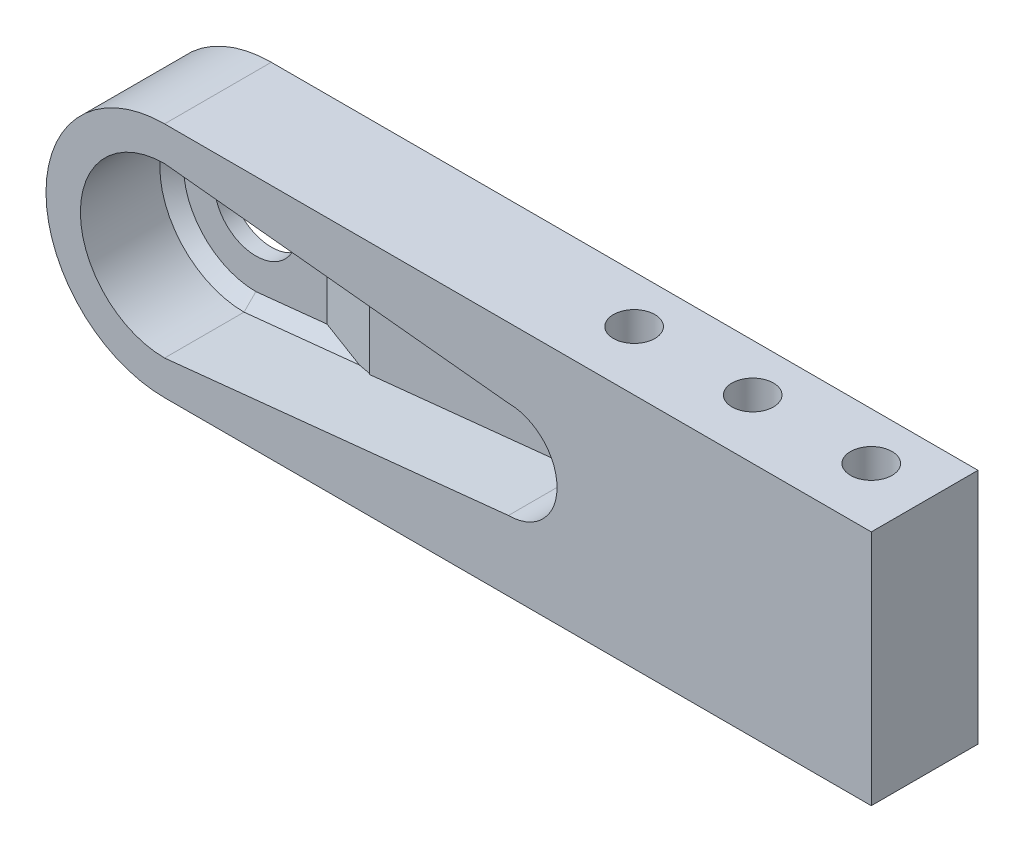
ISO-10303-21;
HEADER;
FILE_DESCRIPTION(('STEP AP214'),'2;1');
FILE_NAME('part.step','',(''),(''),'','','');
FILE_SCHEMA(('AUTOMOTIVE_DESIGN { 1 0 10303 214 1 1 1 1 }'));
ENDSEC;
DATA;
#1=APPLICATION_CONTEXT('core data for automotive mechanical design processes');
#2=APPLICATION_PROTOCOL_DEFINITION('international standard','automotive_design',2000,#1);
#3=PRODUCT_CONTEXT('',#1,'mechanical');
#4=PRODUCT('Part','Part','',(#3));
#5=PRODUCT_RELATED_PRODUCT_CATEGORY('part','',(#4));
#6=PRODUCT_DEFINITION_FORMATION('','',#4);
#7=PRODUCT_DEFINITION_CONTEXT('part definition',#1,'design');
#8=PRODUCT_DEFINITION('design','',#6,#7);
#9=PRODUCT_DEFINITION_SHAPE('','',#8);
#10=(LENGTH_UNIT() NAMED_UNIT(*) SI_UNIT(.MILLI.,.METRE.));
#11=(NAMED_UNIT(*) PLANE_ANGLE_UNIT() SI_UNIT($,.RADIAN.));
#12=(NAMED_UNIT(*) SI_UNIT($,.STERADIAN.) SOLID_ANGLE_UNIT());
#13=UNCERTAINTY_MEASURE_WITH_UNIT(LENGTH_MEASURE(1.E-05),#10,'distance_accuracy_value','');
#14=(GEOMETRIC_REPRESENTATION_CONTEXT(3) GLOBAL_UNCERTAINTY_ASSIGNED_CONTEXT((#13)) GLOBAL_UNIT_ASSIGNED_CONTEXT((#10,
#11,#12)) REPRESENTATION_CONTEXT('',''));
#15=CARTESIAN_POINT('',(0.,0.,0.));
#16=DIRECTION('',(0.,0.,1.));
#17=DIRECTION('',(1.,0.,0.));
#18=AXIS2_PLACEMENT_3D('',#15,#16,#17);
#19=CARTESIAN_POINT('',(0.,2.9,2.3));
#20=DIRECTION('',(-0.0727606875108999,0.703353312605366,0.707106781186547));
#21=DIRECTION('',(0.994691793826551,0.102899151085505,0.));
#22=AXIS2_PLACEMENT_3D('',#19,#20,#21);
#23=PLANE('',#22);
#24=CARTESIAN_POINT('',(-0.000546209909033546,3.90528002912067,1.3));
#25=DIRECTION('',(0.994691793826551,0.102899151085505,0.));
#26=VECTOR('',#25,1.);
#27=LINE('',#24,#26);
#28=CARTESIAN_POINT('',(0.,3.9,1.3));
#29=VERTEX_POINT('',#28);
#30=CARTESIAN_POINT('',(5.99999999999994,4.52602618876643,1.3));
#31=VERTEX_POINT('',#30);
#32=EDGE_CURVE('E234',#29,#31,#27,.T.);
#33=ORIENTED_EDGE('',*,*,#32,.F.);
#34=CARTESIAN_POINT('',(-0.000273104954515824,3.90264001456034,1.30265410308672));
#35=DIRECTION('',(0.000193115045492811,-0.708976050495938,0.705232530822112));
#36=VECTOR('',#35,1.);
#37=LINE('',#34,#36);
#38=CARTESIAN_POINT('',(0.,2.9,2.3));
#39=VERTEX_POINT('',#38);
#40=EDGE_CURVE('E241',#29,#39,#37,.T.);
#41=ORIENTED_EDGE('',*,*,#40,.T.);
#42=DIRECTION('',(0.994691793826551,0.102899151085505,0.));
#43=VECTOR('',#42,1.);
#44=CARTESIAN_POINT('',(0.,2.9,2.3));
#45=LINE('',#44,#43);
#46=CARTESIAN_POINT('',(9.73205080756886,3.90676387664506,2.3));
#47=VERTEX_POINT('',#46);
#48=EDGE_CURVE('E146',#39,#47,#45,.T.);
#49=ORIENTED_EDGE('',*,*,#48,.T.);
#50=DIRECTION('',(0.953753176121489,-0.158257062267282,0.255557393320368));
#51=VECTOR('',#50,1.);
#52=CARTESIAN_POINT('',(10.9484457034078,3.70492645414208,2.62593203001738));
#53=LINE('',#52,#51);
#54=EDGE_CURVE('E226',#47,#31,#53,.F.);
#55=ORIENTED_EDGE('',*,*,#54,.T.);
#56=EDGE_LOOP('',(#33,#41,#49,#55));
#57=FACE_BOUND('',#56,.T.);
#58=ADVANCED_FACE('F35',(#57),#23,.T.);
#59=CARTESIAN_POINT('',(0.,10.,6.));
#60=DIRECTION('',(0.,0.,-1.));
#61=DIRECTION('',(-1.,0.,0.));
#62=AXIS2_PLACEMENT_3D('',#59,#60,#61);
#63=CYLINDRICAL_SURFACE('',#62,10.);
#64=CARTESIAN_POINT('',(0.,10.,0.));
#65=DIRECTION('',(0.,0.,1.));
#66=DIRECTION('',(1.,0.,0.));
#67=AXIS2_PLACEMENT_3D('',#64,#65,#66);
#68=CIRCLE('',#67,10.);
#69=CARTESIAN_POINT('',(0.,20.,0.));
#70=VERTEX_POINT('',#69);
#71=CARTESIAN_POINT('',(0.,0.,0.));
#72=VERTEX_POINT('',#71);
#73=EDGE_CURVE('E233',#70,#72,#68,.T.);
#74=ORIENTED_EDGE('',*,*,#73,.T.);
#75=DIRECTION('',(0.,0.,-1.));
#76=VECTOR('',#75,1.);
#77=CARTESIAN_POINT('',(0.,0.,6.));
#78=LINE('',#77,#76);
#79=CARTESIAN_POINT('',(0.,0.,9.));
#80=VERTEX_POINT('',#79);
#81=EDGE_CURVE('E11',#80,#72,#78,.T.);
#82=ORIENTED_EDGE('',*,*,#81,.F.);
#83=CARTESIAN_POINT('',(0.,10.,9.));
#84=DIRECTION('',(0.,0.,1.));
#85=DIRECTION('',(1.,0.,0.));
#86=AXIS2_PLACEMENT_3D('',#83,#84,#85);
#87=CIRCLE('',#86,10.);
#88=CARTESIAN_POINT('',(0.,20.,9.));
#89=VERTEX_POINT('',#88);
#90=EDGE_CURVE('E181',#89,#80,#87,.T.);
#91=ORIENTED_EDGE('',*,*,#90,.F.);
#92=DIRECTION('',(0.,0.,-1.));
#93=VECTOR('',#92,1.);
#94=CARTESIAN_POINT('',(0.,20.,6.));
#95=LINE('',#94,#93);
#96=EDGE_CURVE('E351',#89,#70,#95,.T.);
#97=ORIENTED_EDGE('',*,*,#96,.T.);
#98=EDGE_LOOP('',(#74,#82,#91,#97));
#99=FACE_BOUND('',#98,.T.);
#100=ADVANCED_FACE('F37',(#99),#63,.T.);
#101=CARTESIAN_POINT('',(0.,0.,6.));
#102=DIRECTION('',(0.,1.,0.));
#103=DIRECTION('',(-1.,0.,0.));
#104=AXIS2_PLACEMENT_3D('',#101,#102,#103);
#105=PLANE('',#104);
#106=CARTESIAN_POINT('',(44.6,0.,3.99999999999993));
#107=DIRECTION('',(0.,-1.,0.));
#108=DIRECTION('',(1.,0.,0.));
#109=AXIS2_PLACEMENT_3D('',#106,#107,#108);
#110=CIRCLE('',#109,1.75);
#111=CARTESIAN_POINT('',(46.35,0.,3.99999999999993));
#112=VERTEX_POINT('',#111);
#113=EDGE_CURVE('E602',#112,#112,#110,.T.);
#114=ORIENTED_EDGE('',*,*,#113,.F.);
#115=EDGE_LOOP('',(#114));
#116=FACE_BOUND('',#115,.T.);
#117=CARTESIAN_POINT('',(34.6,0.,3.99999999999986));
#118=DIRECTION('',(0.,-1.,0.));
#119=DIRECTION('',(1.,0.,0.));
#120=AXIS2_PLACEMENT_3D('',#117,#118,#119);
#121=CIRCLE('',#120,1.75);
#122=CARTESIAN_POINT('',(36.35,0.,3.99999999999986));
#123=VERTEX_POINT('',#122);
#124=EDGE_CURVE('E607',#123,#123,#121,.T.);
#125=ORIENTED_EDGE('',*,*,#124,.F.);
#126=EDGE_LOOP('',(#125));
#127=FACE_BOUND('',#126,.T.);
#128=CARTESIAN_POINT('',(54.6,0.,4.));
#129=DIRECTION('',(0.,-1.,0.));
#130=DIRECTION('',(1.,0.,0.));
#131=AXIS2_PLACEMENT_3D('',#128,#129,#130);
#132=CIRCLE('',#131,1.75);
#133=CARTESIAN_POINT('',(56.35,0.,4.));
#134=VERTEX_POINT('',#133);
#135=EDGE_CURVE('E613',#134,#134,#132,.T.);
#136=ORIENTED_EDGE('',*,*,#135,.F.);
#137=EDGE_LOOP('',(#136));
#138=FACE_BOUND('',#137,.T.);
#139=DIRECTION('',(1.,0.,0.));
#140=VECTOR('',#139,1.);
#141=CARTESIAN_POINT('',(0.,0.,0.));
#142=LINE('',#141,#140);
#143=CARTESIAN_POINT('',(59.6,0.,0.));
#144=VERTEX_POINT('',#143);
#145=EDGE_CURVE('E347',#72,#144,#142,.T.);
#146=ORIENTED_EDGE('',*,*,#145,.T.);
#147=DIRECTION('',(0.,0.,-1.));
#148=VECTOR('',#147,1.);
#149=CARTESIAN_POINT('',(59.6,0.,6.));
#150=LINE('',#149,#148);
#151=CARTESIAN_POINT('',(59.6,0.,9.));
#152=VERTEX_POINT('',#151);
#153=EDGE_CURVE('E48',#152,#144,#150,.T.);
#154=ORIENTED_EDGE('',*,*,#153,.F.);
#155=DIRECTION('',(1.,0.,0.));
#156=VECTOR('',#155,1.);
#157=CARTESIAN_POINT('',(0.,0.,9.));
#158=LINE('',#157,#156);
#159=EDGE_CURVE('E172',#80,#152,#158,.T.);
#160=ORIENTED_EDGE('',*,*,#159,.F.);
#161=ORIENTED_EDGE('',*,*,#81,.T.);
#162=EDGE_LOOP('',(#146,#154,#160,#161));
#163=FACE_BOUND('',#162,.T.);
#164=ADVANCED_FACE('F447',(#116,#127,#138,#163),#105,.F.);
#165=CARTESIAN_POINT('',(59.6,0.,6.));
#166=DIRECTION('',(-1.,0.,0.));
#167=DIRECTION('',(0.,-1.,0.));
#168=AXIS2_PLACEMENT_3D('',#165,#166,#167);
#169=PLANE('',#168);
#170=DIRECTION('',(0.,1.,0.));
#171=VECTOR('',#170,1.);
#172=CARTESIAN_POINT('',(59.6,0.,0.));
#173=LINE('',#172,#171);
#174=CARTESIAN_POINT('',(59.6,20.,0.));
#175=VERTEX_POINT('',#174);
#176=EDGE_CURVE('E64',#144,#175,#173,.T.);
#177=ORIENTED_EDGE('',*,*,#176,.T.);
#178=DIRECTION('',(0.,0.,-1.));
#179=VECTOR('',#178,1.);
#180=CARTESIAN_POINT('',(59.6,20.,6.));
#181=LINE('',#180,#179);
#182=CARTESIAN_POINT('',(59.6,20.,9.));
#183=VERTEX_POINT('',#182);
#184=EDGE_CURVE('E353',#183,#175,#181,.T.);
#185=ORIENTED_EDGE('',*,*,#184,.F.);
#186=DIRECTION('',(0.,1.,0.));
#187=VECTOR('',#186,1.);
#188=CARTESIAN_POINT('',(59.6,0.,9.));
#189=LINE('',#188,#187);
#190=EDGE_CURVE('E175',#152,#183,#189,.T.);
#191=ORIENTED_EDGE('',*,*,#190,.F.);
#192=ORIENTED_EDGE('',*,*,#153,.T.);
#193=EDGE_LOOP('',(#177,#185,#191,#192));
#194=FACE_BOUND('',#193,.T.);
#195=ADVANCED_FACE('F455',(#194),#169,.F.);
#196=CARTESIAN_POINT('',(0.,20.,6.));
#197=DIRECTION('',(0.,-1.,0.));
#198=DIRECTION('',(0.,0.,-1.));
#199=AXIS2_PLACEMENT_3D('',#196,#197,#198);
#200=PLANE('',#199);
#201=CARTESIAN_POINT('',(44.6,20.,3.99999999999993));
#202=DIRECTION('',(0.,-1.,0.));
#203=DIRECTION('',(1.,0.,0.));
#204=AXIS2_PLACEMENT_3D('',#201,#202,#203);
#205=CIRCLE('',#204,1.75);
#206=CARTESIAN_POINT('',(46.35,20.,3.99999999999993));
#207=VERTEX_POINT('',#206);
#208=EDGE_CURVE('E599',#207,#207,#205,.T.);
#209=ORIENTED_EDGE('',*,*,#208,.T.);
#210=EDGE_LOOP('',(#209));
#211=FACE_BOUND('',#210,.T.);
#212=CARTESIAN_POINT('',(34.6,20.,3.99999999999986));
#213=DIRECTION('',(0.,-1.,0.));
#214=DIRECTION('',(1.,0.,0.));
#215=AXIS2_PLACEMENT_3D('',#212,#213,#214);
#216=CIRCLE('',#215,1.75);
#217=CARTESIAN_POINT('',(36.35,20.,3.99999999999986));
#218=VERTEX_POINT('',#217);
#219=EDGE_CURVE('E603',#218,#218,#216,.T.);
#220=ORIENTED_EDGE('',*,*,#219,.T.);
#221=EDGE_LOOP('',(#220));
#222=FACE_BOUND('',#221,.T.);
#223=CARTESIAN_POINT('',(54.6,20.,4.));
#224=DIRECTION('',(0.,-1.,0.));
#225=DIRECTION('',(1.,0.,0.));
#226=AXIS2_PLACEMENT_3D('',#223,#224,#225);
#227=CIRCLE('',#226,1.75);
#228=CARTESIAN_POINT('',(56.35,20.,4.));
#229=VERTEX_POINT('',#228);
#230=EDGE_CURVE('E161',#229,#229,#227,.T.);
#231=ORIENTED_EDGE('',*,*,#230,.T.);
#232=EDGE_LOOP('',(#231));
#233=FACE_BOUND('',#232,.T.);
#234=DIRECTION('',(-1.,0.,0.));
#235=VECTOR('',#234,1.);
#236=CARTESIAN_POINT('',(0.,20.,0.));
#237=LINE('',#236,#235);
#238=EDGE_CURVE('E56',#175,#70,#237,.T.);
#239=ORIENTED_EDGE('',*,*,#238,.T.);
#240=ORIENTED_EDGE('',*,*,#96,.F.);
#241=DIRECTION('',(-1.,0.,0.));
#242=VECTOR('',#241,1.);
#243=CARTESIAN_POINT('',(59.6,20.,9.));
#244=LINE('',#243,#242);
#245=EDGE_CURVE('E178',#183,#89,#244,.T.);
#246=ORIENTED_EDGE('',*,*,#245,.F.);
#247=ORIENTED_EDGE('',*,*,#184,.T.);
#248=EDGE_LOOP('',(#239,#240,#246,#247));
#249=FACE_BOUND('',#248,.T.);
#250=ADVANCED_FACE('F461',(#211,#222,#233,#249),#200,.F.);
#251=CARTESIAN_POINT('',(0.,10.,0.));
#252=DIRECTION('',(0.,0.,1.));
#253=DIRECTION('',(1.,0.,0.));
#254=AXIS2_PLACEMENT_3D('',#251,#252,#253);
#255=PLANE('',#254);
#256=CARTESIAN_POINT('',(17.,9.99999999999992,0.));
#257=DIRECTION('',(0.,0.,1.));
#258=DIRECTION('',(1.,0.,0.));
#259=AXIS2_PLACEMENT_3D('',#256,#257,#258);
#260=CIRCLE('',#259,1.5);
#261=CARTESIAN_POINT('',(18.5,9.99999999999992,0.));
#262=VERTEX_POINT('',#261);
#263=EDGE_CURVE('E185',#262,#262,#260,.T.);
#264=ORIENTED_EDGE('',*,*,#263,.T.);
#265=EDGE_LOOP('',(#264));
#266=FACE_BOUND('',#265,.T.);
#267=CARTESIAN_POINT('',(29.,10.,0.));
#268=DIRECTION('',(0.,0.,1.));
#269=DIRECTION('',(1.,0.,0.));
#270=AXIS2_PLACEMENT_3D('',#267,#268,#269);
#271=CIRCLE('',#270,1.5);
#272=CARTESIAN_POINT('',(30.5,10.,0.));
#273=VERTEX_POINT('',#272);
#274=EDGE_CURVE('E184',#273,#273,#271,.T.);
#275=ORIENTED_EDGE('',*,*,#274,.T.);
#276=EDGE_LOOP('',(#275));
#277=FACE_BOUND('',#276,.T.);
#278=CARTESIAN_POINT('',(0.,10.,0.));
#279=DIRECTION('',(0.,0.,1.));
#280=DIRECTION('',(1.,0.,0.));
#281=AXIS2_PLACEMENT_3D('',#278,#279,#280);
#282=CIRCLE('',#281,3.5);
#283=CARTESIAN_POINT('',(3.5,10.,0.));
#284=VERTEX_POINT('',#283);
#285=EDGE_CURVE('E191',#284,#284,#282,.T.);
#286=ORIENTED_EDGE('',*,*,#285,.T.);
#287=EDGE_LOOP('',(#286));
#288=FACE_BOUND('',#287,.T.);
#289=ORIENTED_EDGE('',*,*,#73,.F.);
#290=ORIENTED_EDGE('',*,*,#238,.F.);
#291=ORIENTED_EDGE('',*,*,#176,.F.);
#292=ORIENTED_EDGE('',*,*,#145,.F.);
#293=EDGE_LOOP('',(#289,#290,#291,#292));
#294=FACE_BOUND('',#293,.T.);
#295=ADVANCED_FACE('F273',(#266,#277,#288,#294),#255,.F.);
#296=CARTESIAN_POINT('',(0.,10.,2.7));
#297=DIRECTION('',(0.,0.,1.));
#298=DIRECTION('',(1.,0.,0.));
#299=AXIS2_PLACEMENT_3D('',#296,#297,#298);
#300=PLANE('',#299);
#301=CARTESIAN_POINT('',(17.,9.99999999999992,2.7));
#302=DIRECTION('',(0.,0.,1.));
#303=DIRECTION('',(1.,0.,0.));
#304=AXIS2_PLACEMENT_3D('',#301,#302,#303);
#305=CIRCLE('',#304,1.5);
#306=CARTESIAN_POINT('',(18.5,9.99999999999992,2.7));
#307=VERTEX_POINT('',#306);
#308=EDGE_CURVE('E195',#307,#307,#305,.T.);
#309=ORIENTED_EDGE('',*,*,#308,.F.);
#310=EDGE_LOOP('',(#309));
#311=FACE_BOUND('',#310,.T.);
#312=CARTESIAN_POINT('',(29.,10.,2.7));
#313=DIRECTION('',(0.,0.,1.));
#314=DIRECTION('',(1.,0.,0.));
#315=AXIS2_PLACEMENT_3D('',#312,#313,#314);
#316=CIRCLE('',#315,1.5);
#317=CARTESIAN_POINT('',(30.5,10.,2.7));
#318=VERTEX_POINT('',#317);
#319=EDGE_CURVE('E188',#318,#318,#316,.T.);
#320=ORIENTED_EDGE('',*,*,#319,.F.);
#321=EDGE_LOOP('',(#320));
#322=FACE_BOUND('',#321,.T.);
#323=DIRECTION('',(0.994691793826551,0.102899151085505,0.));
#324=VECTOR('',#323,1.);
#325=CARTESIAN_POINT('',(0.,2.9,2.7));
#326=LINE('',#325,#324);
#327=CARTESIAN_POINT('',(11.,4.03793103448276,2.7));
#328=VERTEX_POINT('',#327);
#329=CARTESIAN_POINT('',(29.,5.9,2.7));
#330=VERTEX_POINT('',#329);
#331=EDGE_CURVE('E204',#328,#330,#326,.T.);
#332=ORIENTED_EDGE('',*,*,#331,.T.);
#333=CARTESIAN_POINT('',(29.,10.,2.7));
#334=DIRECTION('',(0.,0.,1.));
#335=DIRECTION('',(-1.,0.,0.));
#336=AXIS2_PLACEMENT_3D('',#333,#334,#335);
#337=CIRCLE('',#336,4.1);
#338=CARTESIAN_POINT('',(29.,14.1,2.7));
#339=VERTEX_POINT('',#338);
#340=EDGE_CURVE('E206',#330,#339,#337,.T.);
#341=ORIENTED_EDGE('',*,*,#340,.T.);
#342=DIRECTION('',(-0.994691793826551,0.102899151085505,0.));
#343=VECTOR('',#342,1.);
#344=CARTESIAN_POINT('',(29.,14.1,2.7));
#345=LINE('',#344,#343);
#346=CARTESIAN_POINT('',(11.,15.9620689655172,2.7));
#347=VERTEX_POINT('',#346);
#348=EDGE_CURVE('E208',#339,#347,#345,.T.);
#349=ORIENTED_EDGE('',*,*,#348,.T.);
#350=DIRECTION('',(0.,1.,0.));
#351=VECTOR('',#350,1.);
#352=CARTESIAN_POINT('',(11.,10.,2.7));
#353=LINE('',#352,#351);
#354=EDGE_CURVE('E198',#328,#347,#353,.T.);
#355=ORIENTED_EDGE('',*,*,#354,.F.);
#356=EDGE_LOOP('',(#332,#341,#349,#355));
#357=FACE_BOUND('',#356,.T.);
#358=ADVANCED_FACE('F300',(#311,#322,#357),#300,.T.);
#359=CARTESIAN_POINT('',(0.,10.,6.));
#360=DIRECTION('',(0.,0.,-1.));
#361=DIRECTION('',(-1.,0.,0.));
#362=AXIS2_PLACEMENT_3D('',#359,#360,#361);
#363=CYLINDRICAL_SURFACE('',#362,7.1);
#364=DIRECTION('',(0.,0.,-1.));
#365=VECTOR('',#364,1.);
#366=CARTESIAN_POINT('',(0.,2.9,6.));
#367=LINE('',#366,#365);
#368=CARTESIAN_POINT('',(0.,2.9,9.));
#369=VERTEX_POINT('',#368);
#370=EDGE_CURVE('E137',#369,#39,#367,.T.);
#371=ORIENTED_EDGE('',*,*,#370,.T.);
#372=CARTESIAN_POINT('',(0.,10.,2.3));
#373=DIRECTION('',(0.,0.,1.));
#374=DIRECTION('',(1.,0.,0.));
#375=AXIS2_PLACEMENT_3D('',#372,#373,#374);
#376=CIRCLE('',#375,7.1);
#377=CARTESIAN_POINT('',(0.,17.1,2.3));
#378=VERTEX_POINT('',#377);
#379=EDGE_CURVE('E334',#378,#39,#376,.T.);
#380=ORIENTED_EDGE('',*,*,#379,.F.);
#381=DIRECTION('',(0.,0.,-1.));
#382=VECTOR('',#381,1.);
#383=CARTESIAN_POINT('',(0.,17.1,6.));
#384=LINE('',#383,#382);
#385=CARTESIAN_POINT('',(0.,17.1,9.));
#386=VERTEX_POINT('',#385);
#387=EDGE_CURVE('E157',#386,#378,#384,.T.);
#388=ORIENTED_EDGE('',*,*,#387,.F.);
#389=CARTESIAN_POINT('',(0.,10.,9.));
#390=DIRECTION('',(0.,0.,1.));
#391=DIRECTION('',(1.,0.,0.));
#392=AXIS2_PLACEMENT_3D('',#389,#390,#391);
#393=CIRCLE('',#392,7.1);
#394=EDGE_CURVE('E155',#386,#369,#393,.T.);
#395=ORIENTED_EDGE('',*,*,#394,.T.);
#396=EDGE_LOOP('',(#371,#380,#388,#395));
#397=FACE_BOUND('',#396,.T.);
#398=ADVANCED_FACE('F156',(#397),#363,.F.);
#399=CARTESIAN_POINT('',(0.,2.9,6.));
#400=DIRECTION('',(-0.102899151085505,0.994691793826551,0.));
#401=DIRECTION('',(-0.994691793826551,-0.102899151085505,0.));
#402=AXIS2_PLACEMENT_3D('',#399,#400,#401);
#403=PLANE('',#402);
#404=ORIENTED_EDGE('',*,*,#331,.F.);
#405=DIRECTION('',(0.,0.,1.));
#406=VECTOR('',#405,1.);
#407=CARTESIAN_POINT('',(11.,4.03793103448276,1.3));
#408=LINE('',#407,#406);
#409=CARTESIAN_POINT('',(11.,4.03793103448276,2.63974596215561));
#410=VERTEX_POINT('',#409);
#411=EDGE_CURVE('E199',#410,#328,#408,.T.);
#412=ORIENTED_EDGE('',*,*,#411,.F.);
#413=DIRECTION('',(0.961139410487415,0.0994282148780084,0.257536528853825));
#414=VECTOR('',#413,1.);
#415=CARTESIAN_POINT('',(11.,4.03793103448276,2.63974596215561));
#416=LINE('',#415,#414);
#417=EDGE_CURVE('E218',#47,#410,#416,.T.);
#418=ORIENTED_EDGE('',*,*,#417,.F.);
#419=ORIENTED_EDGE('',*,*,#48,.F.);
#420=ORIENTED_EDGE('',*,*,#370,.F.);
#421=DIRECTION('',(0.994691793826551,0.102899151085505,0.));
#422=VECTOR('',#421,1.);
#423=CARTESIAN_POINT('',(0.,2.9,9.));
#424=LINE('',#423,#422);
#425=CARTESIAN_POINT('',(29.,5.9,9.));
#426=VERTEX_POINT('',#425);
#427=EDGE_CURVE('E143',#369,#426,#424,.T.);
#428=ORIENTED_EDGE('',*,*,#427,.T.);
#429=DIRECTION('',(0.,0.,-1.));
#430=VECTOR('',#429,1.);
#431=CARTESIAN_POINT('',(29.,5.9,6.));
#432=LINE('',#431,#430);
#433=EDGE_CURVE('E152',#426,#330,#432,.T.);
#434=ORIENTED_EDGE('',*,*,#433,.T.);
#435=EDGE_LOOP('',(#404,#412,#418,#419,#420,#428,#434));
#436=FACE_BOUND('',#435,.T.);
#437=ADVANCED_FACE('F140',(#436),#403,.T.);
#438=CARTESIAN_POINT('',(29.,10.,6.));
#439=DIRECTION('',(0.,0.,-1.));
#440=DIRECTION('',(-1.,0.,0.));
#441=AXIS2_PLACEMENT_3D('',#438,#439,#440);
#442=CYLINDRICAL_SURFACE('',#441,4.1);
#443=CARTESIAN_POINT('',(33.1,10.,4.90138781886586));
#444=CARTESIAN_POINT('',(33.1000051550988,10.1046518917901,4.90138674931741));
#445=CARTESIAN_POINT('',(33.0959775510885,10.2092590061566,4.89478586413221));
#446=CARTESIAN_POINT('',(33.0801438991512,10.4160714409658,4.86764384125115));
#447=CARTESIAN_POINT('',(33.0683467880026,10.5182793813101,4.8471187189203));
#448=CARTESIAN_POINT('',(33.0421762862982,10.6900806323533,4.79763721075619));
#449=CARTESIAN_POINT('',(33.0293671627521,10.7610070069047,4.77247243677399));
#450=CARTESIAN_POINT('',(33.0010753208154,10.8979063931997,4.71208308848941));
#451=CARTESIAN_POINT('',(32.9855975088589,10.963888181783,4.67687689914913));
#452=CARTESIAN_POINT('',(32.9586378610383,11.0682328382178,4.60772429727414));
#453=CARTESIAN_POINT('',(32.9474400680457,11.1087316397467,4.5768997656198));
#454=CARTESIAN_POINT('',(32.9253627334281,11.1845141123822,4.50926725950813));
#455=CARTESIAN_POINT('',(32.9144827401532,11.21980550554,4.47246831821198));
#456=CARTESIAN_POINT('',(32.8963949267512,11.2762394185318,4.40156469757444));
#457=CARTESIAN_POINT('',(32.888906453001,11.2987857973146,4.36865597906154));
#458=CARTESIAN_POINT('',(32.8754403922448,11.3384320675241,4.29939147720524));
#459=CARTESIAN_POINT('',(32.8694619983973,11.3555348687508,4.26303754899101));
#460=CARTESIAN_POINT('',(32.8596249581817,11.3832997206473,4.18725424186326));
#461=CARTESIAN_POINT('',(32.8557859744391,11.3939021142863,4.14780001924708));
#462=CARTESIAN_POINT('',(32.8508384942023,11.4075152577289,4.06743800701252));
#463=CARTESIAN_POINT('',(32.849727504163,11.4105329404597,4.02653157952315));
#464=CARTESIAN_POINT('',(32.8503413617208,11.4088536336775,3.95078892802119));
#465=CARTESIAN_POINT('',(32.8516831940507,11.4051987027084,3.91592162822185));
#466=CARTESIAN_POINT('',(32.8563312793344,11.3923918471545,3.84735684322382));
#467=CARTESIAN_POINT('',(32.8596375995526,11.3832397343451,3.81365939812297));
#468=CARTESIAN_POINT('',(32.8678730872704,11.3600390712003,3.74837032150453));
#469=CARTESIAN_POINT('',(32.8727963680962,11.3460082713936,3.71677154399644));
#470=CARTESIAN_POINT('',(32.8838567532732,11.3137534389384,3.65604245894804));
#471=CARTESIAN_POINT('',(32.8899943659249,11.2955276498085,3.62691319242571));
#472=CARTESIAN_POINT('',(32.9063620455117,11.2455217990745,3.55735489104043));
#473=CARTESIAN_POINT('',(32.9170962106397,11.2115387543292,3.51862530110431));
#474=CARTESIAN_POINT('',(32.9391487036389,11.1378049619772,3.44730412465943));
#475=CARTESIAN_POINT('',(32.9504683894062,11.0980403809324,3.4147277031817));
#476=CARTESIAN_POINT('',(32.9778649809206,10.9952594298713,3.34172251954782));
#477=CARTESIAN_POINT('',(32.9937522151565,10.929920885739,3.30450728442852));
#478=CARTESIAN_POINT('',(33.0230202873418,10.7938420767317,3.24047976580668));
#479=CARTESIAN_POINT('',(33.0363965003143,10.7230921755844,3.21368658296629));
#480=CARTESIAN_POINT('',(33.0562768373292,10.5994380986358,3.17554304421976));
#481=CARTESIAN_POINT('',(33.0636478576573,10.5473363373647,3.16196772821175));
#482=CARTESIAN_POINT('',(33.0764523803432,10.4419907665265,3.13891089730452));
#483=CARTESIAN_POINT('',(33.0818851002383,10.3887465049235,3.12943103535325));
#484=CARTESIAN_POINT('',(33.0950732153661,10.2278716374056,3.10667462412382));
#485=CARTESIAN_POINT('',(33.099712708851,10.119134681132,3.09909164565187));
#486=CARTESIAN_POINT('',(33.1002666963785,9.89937051192052,3.09816696113741));
#487=CARTESIAN_POINT('',(33.0960028583711,9.78834145063827,3.10511633955796));
#488=CARTESIAN_POINT('',(33.0830976488733,9.62403670460345,3.12732304051548));
#489=CARTESIAN_POINT('',(33.0777133360729,9.56965598305177,3.13668492823201));
#490=CARTESIAN_POINT('',(33.0649158446282,9.46205168965955,3.15964736038742));
#491=CARTESIAN_POINT('',(33.0575036273047,9.40882758240227,3.17324589688113));
#492=CARTESIAN_POINT('',(33.0382943592132,9.28797797315336,3.20997841544025));
#493=CARTESIAN_POINT('',(33.0258497027018,9.22094132262973,3.23475772401942));
#494=CARTESIAN_POINT('',(32.9986244530177,9.09151176052728,3.29349650549093));
#495=CARTESIAN_POINT('',(32.9838474853473,9.02911185910495,3.32744178744204));
#496=CARTESIAN_POINT('',(32.9575446789427,8.92771494655853,3.39521197823158));
#497=CARTESIAN_POINT('',(32.9462373534188,8.88699011575456,3.42652167201797));
#498=CARTESIAN_POINT('',(32.9239843264078,8.81092154160993,3.49524999089828));
#499=CARTESIAN_POINT('',(32.9130380883578,8.77556950373638,3.53265901087482));
#500=CARTESIAN_POINT('',(32.8950490194111,8.71966858511576,3.60419318938955));
#501=CARTESIAN_POINT('',(32.8876921683389,8.69759150876778,3.63703834619799));
#502=CARTESIAN_POINT('',(32.8745001026901,8.65885574024736,3.70609178659473));
#503=CARTESIAN_POINT('',(32.8686640224774,8.64219396429708,3.74229814097087));
#504=CARTESIAN_POINT('',(32.8591056533168,8.61525687076649,3.81768296881913));
#505=CARTESIAN_POINT('',(32.8554023521488,8.60503884682639,3.85688472405298));
#506=CARTESIAN_POINT('',(32.8506919173023,8.59208564679694,3.93666248353533));
#507=CARTESIAN_POINT('',(32.849682505523,8.58934414810422,3.97723729722236));
#508=CARTESIAN_POINT('',(32.8504400674719,8.59141597804774,4.05255051888478));
#509=CARTESIAN_POINT('',(32.8518443397893,8.59524226067282,4.08732424564961));
#510=CARTESIAN_POINT('',(32.8566015863743,8.60835622848705,4.15567811989086));
#511=CARTESIAN_POINT('',(32.8599546455808,8.61764415172497,4.18925821527452));
#512=CARTESIAN_POINT('',(32.8682797841675,8.6411166029694,4.25441263590021));
#513=CARTESIAN_POINT('',(32.8732514868617,8.65529999176372,4.28598742576991));
#514=CARTESIAN_POINT('',(32.8843992736302,8.68784948943354,4.34665126635589));
#515=CARTESIAN_POINT('',(32.8905758748301,8.70621739481501,4.37573924202942));
#516=CARTESIAN_POINT('',(32.9070561473904,8.75664963683941,4.44529877091593));
#517=CARTESIAN_POINT('',(32.9178623899176,8.79093161443616,4.48404643557078));
#518=CARTESIAN_POINT('',(32.9400369039196,8.86526405505772,4.55535863235794));
#519=CARTESIAN_POINT('',(32.9514064768395,8.90532832784329,4.58790791662235));
#520=CARTESIAN_POINT('',(32.9789061309521,9.00888095856856,4.66083691589243));
#521=CARTESIAN_POINT('',(32.9948319786872,9.07469439950402,4.69797678102772));
#522=CARTESIAN_POINT('',(33.0241211088357,9.21171536467511,4.76179735349458));
#523=CARTESIAN_POINT('',(33.0374794497646,9.2829329297265,4.78845799325788));
#524=CARTESIAN_POINT('',(33.0572859836413,9.40740090179041,4.82634154235067));
#525=CARTESIAN_POINT('',(33.0646140201015,9.45985410126849,4.8397991975281));
#526=CARTESIAN_POINT('',(33.0773038529576,9.56589061735687,4.86259138723709));
#527=CARTESIAN_POINT('',(33.0826648365836,9.61947439146271,4.87192421775017));
#528=CARTESIAN_POINT('',(33.0955890645055,9.78132078658011,4.89418895776349));
#529=CARTESIAN_POINT('',(33.09999461519,9.89068482173791,4.90138893607337));
#530=CARTESIAN_POINT('',(33.1,10.,4.90138781886586));
#531=B_SPLINE_CURVE_WITH_KNOTS('',3,(#443,#444,#445,#446,#447,#448,#449,#450,#451,#452,#453,
#454,#455,#456,#457,#458,#459,#460,#461,#462,#463,#464,#465,#466,#467,#468,#469,#470,#471,#472,
#473,#474,#475,#476,#477,#478,#479,#480,#481,#482,#483,#484,#485,#486,#487,#488,#489,#490,#491,
#492,#493,#494,#495,#496,#497,#498,#499,#500,#501,#502,#503,#504,#505,#506,#507,#508,#509,#510,
#511,#512,#513,#514,#515,#516,#517,#518,#519,#520,#521,#522,#523,#524,#525,#526,#527,#528,#529,
#530),.UNSPECIFIED.,.T.,.F.,(4,2,2,2,2,2,2,2,2,2,2,2,2,2,2,2,2,2,2,2,2,2,2,2,2,2,2,2,2,2,2,2,2,
2,2,2,2,2,2,2,2,2,2,4),(0.,0.31360262924719,0.626845169512862,0.855209330312574,
1.08315803099075,1.23902694776076,1.39466235253718,1.5159701262934,1.63721294708533,
1.7595524312339,1.88178004827083,1.98651896504135,2.09126146829614,2.19562679844378,
2.30003590708958,2.45703961288978,2.614425358571,2.8437255747575,3.07344407509929,
3.23627170257654,3.39916498692939,3.72506319177785,4.05755163283947,4.22370612128669,
4.38978198087217,4.6067863831914,4.82345672247592,4.98076265627209,5.13782321842833,
5.25813097954279,5.37837011009612,5.49966378994045,5.62085486463627,5.72538058570167,
5.82991086291878,5.93441683152489,6.03896775170155,6.19663161299104,6.35467845034647,
6.58510009193955,6.81596086263326,6.97969156065408,7.14348983486728,7.47106659180138),.UNSPECIFIED.);
#532=CARTESIAN_POINT('',(33.1,10.,4.90138781886586));
#533=VERTEX_POINT('',#532);
#534=EDGE_CURVE('E39',#533,#533,#531,.T.);
#535=ORIENTED_EDGE('',*,*,#534,.F.);
#536=EDGE_LOOP('',(#535));
#537=FACE_BOUND('',#536,.T.);
#538=ORIENTED_EDGE('',*,*,#340,.F.);
#539=ORIENTED_EDGE('',*,*,#433,.F.);
#540=CARTESIAN_POINT('',(29.,10.,9.));
#541=DIRECTION('',(0.,0.,1.));
#542=DIRECTION('',(1.,0.,0.));
#543=AXIS2_PLACEMENT_3D('',#540,#541,#542);
#544=CIRCLE('',#543,4.1);
#545=CARTESIAN_POINT('',(29.,14.1,9.));
#546=VERTEX_POINT('',#545);
#547=EDGE_CURVE('E165',#426,#546,#544,.T.);
#548=ORIENTED_EDGE('',*,*,#547,.T.);
#549=DIRECTION('',(0.,0.,-1.));
#550=VECTOR('',#549,1.);
#551=CARTESIAN_POINT('',(29.,14.1,6.));
#552=LINE('',#551,#550);
#553=EDGE_CURVE('E212',#546,#339,#552,.T.);
#554=ORIENTED_EDGE('',*,*,#553,.T.);
#555=EDGE_LOOP('',(#538,#539,#548,#554));
#556=FACE_BOUND('',#555,.T.);
#557=ADVANCED_FACE('F310',(#537,#556),#442,.F.);
#558=CARTESIAN_POINT('',(29.,14.1,6.));
#559=DIRECTION('',(-0.102899151085505,-0.994691793826551,0.));
#560=DIRECTION('',(0.994691793826551,-0.102899151085505,0.));
#561=AXIS2_PLACEMENT_3D('',#558,#559,#560);
#562=PLANE('',#561);
#563=ORIENTED_EDGE('',*,*,#553,.F.);
#564=DIRECTION('',(-0.994691793826551,0.102899151085505,0.));
#565=VECTOR('',#564,1.);
#566=CARTESIAN_POINT('',(29.,14.1,9.));
#567=LINE('',#566,#565);
#568=EDGE_CURVE('E167',#546,#386,#567,.T.);
#569=ORIENTED_EDGE('',*,*,#568,.T.);
#570=ORIENTED_EDGE('',*,*,#387,.T.);
#571=DIRECTION('',(-0.994691793826551,0.102899151085505,0.));
#572=VECTOR('',#571,1.);
#573=CARTESIAN_POINT('',(29.,14.1,2.3));
#574=LINE('',#573,#572);
#575=CARTESIAN_POINT('',(9.73205080756886,16.0932361233549,2.3));
#576=VERTEX_POINT('',#575);
#577=EDGE_CURVE('E230',#576,#378,#574,.T.);
#578=ORIENTED_EDGE('',*,*,#577,.F.);
#579=DIRECTION('',(-0.961139410487415,0.0994282148780084,-0.257536528853825));
#580=VECTOR('',#579,1.);
#581=CARTESIAN_POINT('',(12.1395227987338,15.8441872966827,2.94508017583319));
#582=LINE('',#581,#580);
#583=CARTESIAN_POINT('',(11.,15.9620689655172,2.63974596215561));
#584=VERTEX_POINT('',#583);
#585=EDGE_CURVE('E151',#584,#576,#582,.T.);
#586=ORIENTED_EDGE('',*,*,#585,.F.);
#587=DIRECTION('',(0.,0.,1.));
#588=VECTOR('',#587,1.);
#589=CARTESIAN_POINT('',(11.,15.9620689655172,1.3));
#590=LINE('',#589,#588);
#591=EDGE_CURVE('E196',#584,#347,#590,.T.);
#592=ORIENTED_EDGE('',*,*,#591,.T.);
#593=ORIENTED_EDGE('',*,*,#348,.F.);
#594=EDGE_LOOP('',(#563,#569,#570,#578,#586,#592,#593));
#595=FACE_BOUND('',#594,.T.);
#596=ADVANCED_FACE('F313',(#595),#562,.T.);
#597=CARTESIAN_POINT('',(11.,4.03793103448276,1.3));
#598=DIRECTION('',(1.,0.,0.));
#599=DIRECTION('',(0.,0.,-1.));
#600=AXIS2_PLACEMENT_3D('',#597,#598,#599);
#601=PLANE('',#600);
#602=ORIENTED_EDGE('',*,*,#411,.T.);
#603=ORIENTED_EDGE('',*,*,#354,.T.);
#604=ORIENTED_EDGE('',*,*,#591,.F.);
#605=DIRECTION('',(0.,1.,0.));
#606=VECTOR('',#605,1.);
#607=CARTESIAN_POINT('',(11.,15.9620689655172,2.63974596215561));
#608=LINE('',#607,#606);
#609=EDGE_CURVE('E220',#410,#584,#608,.T.);
#610=ORIENTED_EDGE('',*,*,#609,.F.);
#611=EDGE_LOOP('',(#602,#603,#604,#610));
#612=FACE_BOUND('',#611,.T.);
#613=ADVANCED_FACE('F318',(#612),#601,.F.);
#614=CARTESIAN_POINT('',(0.,10.,1.3));
#615=DIRECTION('',(0.,0.,1.));
#616=DIRECTION('',(1.,0.,0.));
#617=AXIS2_PLACEMENT_3D('',#614,#615,#616);
#618=PLANE('',#617);
#619=CARTESIAN_POINT('',(0.,10.,1.3));
#620=DIRECTION('',(0.,0.,1.));
#621=DIRECTION('',(1.,0.,0.));
#622=AXIS2_PLACEMENT_3D('',#619,#620,#621);
#623=CIRCLE('',#622,3.5);
#624=CARTESIAN_POINT('',(3.5,10.,1.3));
#625=VERTEX_POINT('',#624);
#626=EDGE_CURVE('E194',#625,#625,#623,.T.);
#627=ORIENTED_EDGE('',*,*,#626,.F.);
#628=EDGE_LOOP('',(#627));
#629=FACE_BOUND('',#628,.T.);
#630=ORIENTED_EDGE('',*,*,#32,.T.);
#631=DIRECTION('',(0.,-1.,0.));
#632=VECTOR('',#631,1.);
#633=CARTESIAN_POINT('',(5.99999999999994,4.03793103448276,1.3));
#634=LINE('',#633,#632);
#635=CARTESIAN_POINT('',(5.99999999999994,15.4739738112336,1.3));
#636=VERTEX_POINT('',#635);
#637=EDGE_CURVE('E223',#636,#31,#634,.T.);
#638=ORIENTED_EDGE('',*,*,#637,.F.);
#639=DIRECTION('',(0.994691793826551,-0.102899151085505,0.));
#640=VECTOR('',#639,1.);
#641=CARTESIAN_POINT('',(0.623806731267436,16.0301317355852,1.3));
#642=LINE('',#641,#640);
#643=CARTESIAN_POINT('',(-0.0496344437445387,16.0997980640347,1.3));
#644=VERTEX_POINT('',#643);
#645=EDGE_CURVE('E227',#644,#636,#642,.T.);
#646=ORIENTED_EDGE('',*,*,#645,.F.);
#647=CARTESIAN_POINT('',(0.,10.,1.3));
#648=DIRECTION('',(0.,0.,1.));
#649=DIRECTION('',(1.,0.,0.));
#650=AXIS2_PLACEMENT_3D('',#647,#648,#649);
#651=CIRCLE('',#650,6.1);
#652=EDGE_CURVE('E229',#29,#644,#651,.F.);
#653=ORIENTED_EDGE('',*,*,#652,.F.);
#654=EDGE_LOOP('',(#630,#638,#646,#653));
#655=FACE_BOUND('',#654,.T.);
#656=ADVANCED_FACE('F357',(#629,#655),#618,.T.);
#657=CARTESIAN_POINT('',(11.,4.03793103448276,2.63974596215561));
#658=DIRECTION('',(0.258819045102518,0.,-0.965925826289069));
#659=DIRECTION('',(0.,-1.,0.));
#660=AXIS2_PLACEMENT_3D('',#657,#658,#659);
#661=PLANE('',#660);
#662=ORIENTED_EDGE('',*,*,#417,.T.);
#663=ORIENTED_EDGE('',*,*,#609,.T.);
#664=ORIENTED_EDGE('',*,*,#585,.T.);
#665=DIRECTION('',(-0.953753176121489,-0.158257062267282,-0.255557393320368));
#666=VECTOR('',#665,1.);
#667=CARTESIAN_POINT('',(9.14863807633552,15.996429960874,2.14367502981199));
#668=LINE('',#667,#666);
#669=EDGE_CURVE('E224',#636,#576,#668,.F.);
#670=ORIENTED_EDGE('',*,*,#669,.F.);
#671=ORIENTED_EDGE('',*,*,#637,.T.);
#672=ORIENTED_EDGE('',*,*,#54,.F.);
#673=EDGE_LOOP('',(#662,#663,#664,#670,#671,#672));
#674=FACE_BOUND('',#673,.T.);
#675=ADVANCED_FACE('F262',(#674),#661,.F.);
#676=CARTESIAN_POINT('',(29.,14.1,2.3));
#677=DIRECTION('',(-0.0727606875108999,-0.703353312605365,0.707106781186548));
#678=DIRECTION('',(-0.994691793826551,0.102899151085505,0.));
#679=AXIS2_PLACEMENT_3D('',#676,#677,#678);
#680=PLANE('',#679);
#681=ORIENTED_EDGE('',*,*,#669,.T.);
#682=ORIENTED_EDGE('',*,*,#577,.T.);
#683=CARTESIAN_POINT('',(-0.0496344437446034,16.0997980640341,1.3));
#684=CARTESIAN_POINT('',(-0.0417000827660496,16.2665242409533,1.46665759900643));
#685=CARTESIAN_POINT('',(-0.0335966984632353,16.4332374940085,1.63331973510803));
#686=CARTESIAN_POINT('',(-0.0170518838572885,16.7666381393286,1.96665306844202));
#687=CARTESIAN_POINT('',(-0.00861045358064435,16.9333255315956,2.1333242656737));
#688=CARTESIAN_POINT('',(-6.22809095962573E-12,17.1000000000005,2.29999999999983));
#689=B_SPLINE_CURVE_WITH_KNOTS('',3,(#683,#684,#685,#686,#687,#688),.UNSPECIFIED.,.F.,.F.,(4,2,
4),(0.,0.707613715753279,1.41522737605991),.UNSPECIFIED.);
#690=EDGE_CURVE('E201',#378,#644,#689,.F.);
#691=ORIENTED_EDGE('',*,*,#690,.T.);
#692=ORIENTED_EDGE('',*,*,#645,.T.);
#693=EDGE_LOOP('',(#681,#682,#691,#692));
#694=FACE_BOUND('',#693,.T.);
#695=ADVANCED_FACE('F261',(#694),#680,.T.);
#696=CARTESIAN_POINT('',(0.,10.,2.3));
#697=DIRECTION('',(0.,0.,1.));
#698=DIRECTION('',(1.,0.,0.));
#699=AXIS2_PLACEMENT_3D('',#696,#697,#698);
#700=CONICAL_SURFACE('',#699,7.1,0.785398163397448);
#701=ORIENTED_EDGE('',*,*,#690,.F.);
#702=ORIENTED_EDGE('',*,*,#379,.T.);
#703=ORIENTED_EDGE('',*,*,#40,.F.);
#704=ORIENTED_EDGE('',*,*,#652,.T.);
#705=EDGE_LOOP('',(#701,#702,#703,#704));
#706=FACE_BOUND('',#705,.T.);
#707=ADVANCED_FACE('F251',(#706),#700,.F.);
#708=CARTESIAN_POINT('',(0.,10.,0.));
#709=DIRECTION('',(0.,0.,1.));
#710=DIRECTION('',(1.,0.,0.));
#711=AXIS2_PLACEMENT_3D('',#708,#709,#710);
#712=CYLINDRICAL_SURFACE('',#711,3.5);
#713=ORIENTED_EDGE('',*,*,#626,.T.);
#714=EDGE_LOOP('',(#713));
#715=FACE_BOUND('',#714,.T.);
#716=ORIENTED_EDGE('',*,*,#285,.F.);
#717=EDGE_LOOP('',(#716));
#718=FACE_BOUND('',#717,.T.);
#719=ADVANCED_FACE('F260',(#715,#718),#712,.F.);
#720=CARTESIAN_POINT('',(29.,10.,0.));
#721=DIRECTION('',(0.,0.,1.));
#722=DIRECTION('',(1.,0.,0.));
#723=AXIS2_PLACEMENT_3D('',#720,#721,#722);
#724=CYLINDRICAL_SURFACE('',#723,1.5);
#725=ORIENTED_EDGE('',*,*,#319,.T.);
#726=EDGE_LOOP('',(#725));
#727=FACE_BOUND('',#726,.T.);
#728=ORIENTED_EDGE('',*,*,#274,.F.);
#729=EDGE_LOOP('',(#728));
#730=FACE_BOUND('',#729,.T.);
#731=ADVANCED_FACE('F487',(#727,#730),#724,.F.);
#732=CARTESIAN_POINT('',(17.,9.99999999999992,0.));
#733=DIRECTION('',(0.,0.,1.));
#734=DIRECTION('',(1.,0.,0.));
#735=AXIS2_PLACEMENT_3D('',#732,#733,#734);
#736=CYLINDRICAL_SURFACE('',#735,1.5);
#737=ORIENTED_EDGE('',*,*,#308,.T.);
#738=EDGE_LOOP('',(#737));
#739=FACE_BOUND('',#738,.T.);
#740=ORIENTED_EDGE('',*,*,#263,.F.);
#741=EDGE_LOOP('',(#740));
#742=FACE_BOUND('',#741,.T.);
#743=ADVANCED_FACE('F297',(#739,#742),#736,.F.);
#744=CARTESIAN_POINT('',(0.,10.,9.));
#745=DIRECTION('',(0.,0.,1.));
#746=DIRECTION('',(1.,0.,0.));
#747=AXIS2_PLACEMENT_3D('',#744,#745,#746);
#748=PLANE('',#747);
#749=ORIENTED_EDGE('',*,*,#159,.T.);
#750=ORIENTED_EDGE('',*,*,#190,.T.);
#751=ORIENTED_EDGE('',*,*,#245,.T.);
#752=ORIENTED_EDGE('',*,*,#90,.T.);
#753=EDGE_LOOP('',(#749,#750,#751,#752));
#754=FACE_BOUND('',#753,.T.);
#755=ORIENTED_EDGE('',*,*,#427,.F.);
#756=ORIENTED_EDGE('',*,*,#394,.F.);
#757=ORIENTED_EDGE('',*,*,#568,.F.);
#758=ORIENTED_EDGE('',*,*,#547,.F.);
#759=EDGE_LOOP('',(#755,#756,#757,#758));
#760=FACE_BOUND('',#759,.T.);
#761=ADVANCED_FACE('F163',(#754,#760),#748,.T.);
#762=CARTESIAN_POINT('',(54.6,20.,4.));
#763=DIRECTION('',(0.,-1.,0.));
#764=DIRECTION('',(1.,0.,0.));
#765=AXIS2_PLACEMENT_3D('',#762,#763,#764);
#766=CYLINDRICAL_SURFACE('',#765,1.75);
#767=ORIENTED_EDGE('',*,*,#230,.F.);
#768=EDGE_LOOP('',(#767));
#769=FACE_BOUND('',#768,.T.);
#770=ORIENTED_EDGE('',*,*,#135,.T.);
#771=EDGE_LOOP('',(#770));
#772=FACE_BOUND('',#771,.T.);
#773=ADVANCED_FACE('F509',(#769,#772),#766,.F.);
#774=CARTESIAN_POINT('',(34.6,20.,3.99999999999986));
#775=DIRECTION('',(0.,-1.,0.));
#776=DIRECTION('',(1.,0.,0.));
#777=AXIS2_PLACEMENT_3D('',#774,#775,#776);
#778=CYLINDRICAL_SURFACE('',#777,1.75);
#779=ORIENTED_EDGE('',*,*,#534,.T.);
#780=EDGE_LOOP('',(#779));
#781=FACE_BOUND('',#780,.T.);
#782=ORIENTED_EDGE('',*,*,#219,.F.);
#783=EDGE_LOOP('',(#782));
#784=FACE_BOUND('',#783,.T.);
#785=ORIENTED_EDGE('',*,*,#124,.T.);
#786=EDGE_LOOP('',(#785));
#787=FACE_BOUND('',#786,.T.);
#788=ADVANCED_FACE('F516',(#781,#784,#787),#778,.F.);
#789=CARTESIAN_POINT('',(44.6,20.,3.99999999999993));
#790=DIRECTION('',(0.,-1.,0.));
#791=DIRECTION('',(1.,0.,0.));
#792=AXIS2_PLACEMENT_3D('',#789,#790,#791);
#793=CYLINDRICAL_SURFACE('',#792,1.75);
#794=ORIENTED_EDGE('',*,*,#208,.F.);
#795=EDGE_LOOP('',(#794));
#796=FACE_BOUND('',#795,.T.);
#797=ORIENTED_EDGE('',*,*,#113,.T.);
#798=EDGE_LOOP('',(#797));
#799=FACE_BOUND('',#798,.T.);
#800=ADVANCED_FACE('F524',(#796,#799),#793,.F.);
#801=CLOSED_SHELL('',(#58,#100,#164,#195,#250,#295,#358,#398,#437,#557,#596,#613,#656,#675,#695,
#707,#719,#731,#743,#761,#773,#788,#800));
#802=MANIFOLD_SOLID_BREP('B2',#801);
#803=ADVANCED_BREP_SHAPE_REPRESENTATION('',(#18,#802),#14);
#804=SHAPE_DEFINITION_REPRESENTATION(#9,#803);
ENDSEC;
END-ISO-10303-21;
